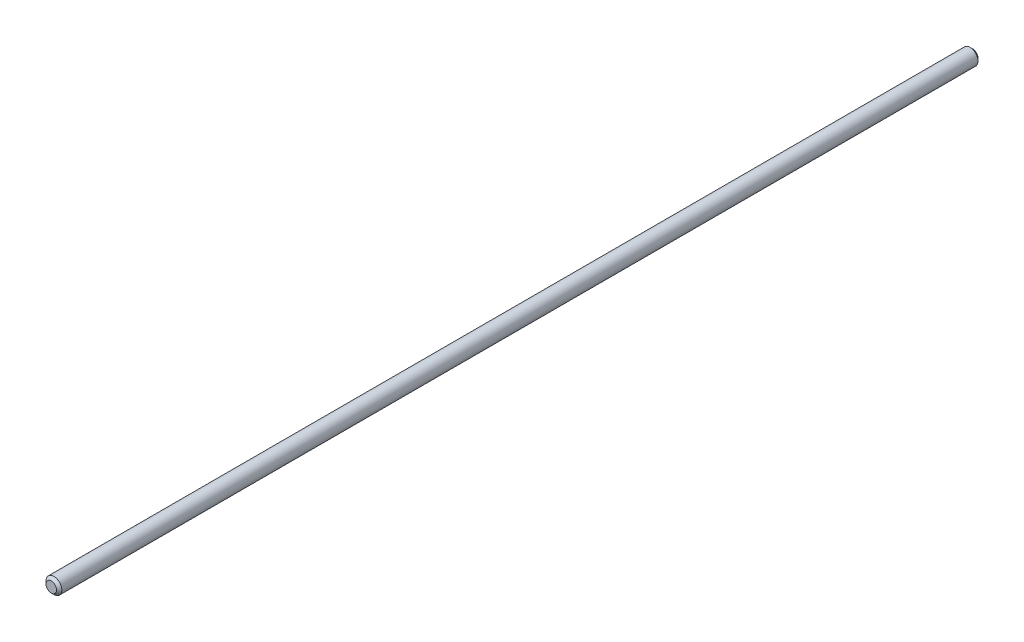
ISO-10303-21;
HEADER;
FILE_DESCRIPTION(('STEP AP214'),'2;1');
FILE_NAME('part.step','',(''),(''),'','','');
FILE_SCHEMA(('AUTOMOTIVE_DESIGN { 1 0 10303 214 1 1 1 1 }'));
ENDSEC;
DATA;
#1=APPLICATION_CONTEXT('core data for automotive mechanical design processes');
#2=APPLICATION_PROTOCOL_DEFINITION('international standard','automotive_design',2000,#1);
#3=PRODUCT_CONTEXT('',#1,'mechanical');
#4=PRODUCT('Part','Part','',(#3));
#5=PRODUCT_RELATED_PRODUCT_CATEGORY('part','',(#4));
#6=PRODUCT_DEFINITION_FORMATION('','',#4);
#7=PRODUCT_DEFINITION_CONTEXT('part definition',#1,'design');
#8=PRODUCT_DEFINITION('design','',#6,#7);
#9=PRODUCT_DEFINITION_SHAPE('','',#8);
#10=(LENGTH_UNIT() NAMED_UNIT(*) SI_UNIT(.MILLI.,.METRE.));
#11=(NAMED_UNIT(*) PLANE_ANGLE_UNIT() SI_UNIT($,.RADIAN.));
#12=(NAMED_UNIT(*) SI_UNIT($,.STERADIAN.) SOLID_ANGLE_UNIT());
#13=UNCERTAINTY_MEASURE_WITH_UNIT(LENGTH_MEASURE(1.E-05),#10,'distance_accuracy_value','');
#14=(GEOMETRIC_REPRESENTATION_CONTEXT(3) GLOBAL_UNCERTAINTY_ASSIGNED_CONTEXT((#13)) GLOBAL_UNIT_ASSIGNED_CONTEXT((#10,
#11,#12)) REPRESENTATION_CONTEXT('',''));
#15=CARTESIAN_POINT('',(0.,0.,0.));
#16=DIRECTION('',(0.,0.,1.));
#17=DIRECTION('',(1.,0.,0.));
#18=AXIS2_PLACEMENT_3D('',#15,#16,#17);
#19=CARTESIAN_POINT('',(0.,0.,175.));
#20=DIRECTION('',(0.,0.,-1.));
#21=DIRECTION('',(-1.,0.,0.));
#22=AXIS2_PLACEMENT_3D('',#19,#20,#21);
#23=CYLINDRICAL_SURFACE('',#22,1.5);
#24=CARTESIAN_POINT('',(0.,0.,0.500000000000028));
#25=DIRECTION('',(0.,0.,1.));
#26=DIRECTION('',(1.,0.,0.));
#27=AXIS2_PLACEMENT_3D('',#24,#25,#26);
#28=CIRCLE('',#27,1.5);
#29=CARTESIAN_POINT('',(1.5,0.,0.500000000000028));
#30=VERTEX_POINT('',#29);
#31=EDGE_CURVE('E47',#30,#30,#28,.T.);
#32=ORIENTED_EDGE('',*,*,#31,.T.);
#33=EDGE_LOOP('',(#32));
#34=FACE_BOUND('',#33,.T.);
#35=CARTESIAN_POINT('',(0.,0.,174.5));
#36=DIRECTION('',(0.,0.,1.));
#37=DIRECTION('',(1.,0.,0.));
#38=AXIS2_PLACEMENT_3D('',#35,#36,#37);
#39=CIRCLE('',#38,1.5);
#40=CARTESIAN_POINT('',(1.5,0.,174.5));
#41=VERTEX_POINT('',#40);
#42=EDGE_CURVE('E51',#41,#41,#39,.F.);
#43=ORIENTED_EDGE('',*,*,#42,.T.);
#44=EDGE_LOOP('',(#43));
#45=FACE_BOUND('',#44,.T.);
#46=ADVANCED_FACE('F35',(#34,#45),#23,.T.);
#47=CARTESIAN_POINT('',(0.,0.,175.));
#48=DIRECTION('',(0.,0.,1.));
#49=DIRECTION('',(1.,0.,0.));
#50=AXIS2_PLACEMENT_3D('',#47,#48,#49);
#51=PLANE('',#50);
#52=CARTESIAN_POINT('',(0.,0.,175.));
#53=DIRECTION('',(0.,0.,1.));
#54=DIRECTION('',(1.,0.,0.));
#55=AXIS2_PLACEMENT_3D('',#52,#53,#54);
#56=CIRCLE('',#55,0.999999999999987);
#57=CARTESIAN_POINT('',(0.999999999999987,0.,175.));
#58=VERTEX_POINT('',#57);
#59=EDGE_CURVE('E10',#58,#58,#56,.T.);
#60=ORIENTED_EDGE('',*,*,#59,.T.);
#61=EDGE_LOOP('',(#60));
#62=FACE_BOUND('',#61,.T.);
#63=ADVANCED_FACE('F67',(#62),#51,.T.);
#64=CARTESIAN_POINT('',(0.,0.,0.));
#65=DIRECTION('',(0.,0.,1.));
#66=DIRECTION('',(1.,0.,0.));
#67=AXIS2_PLACEMENT_3D('',#64,#65,#66);
#68=PLANE('',#67);
#69=CARTESIAN_POINT('',(0.,0.,0.));
#70=DIRECTION('',(0.,0.,1.));
#71=DIRECTION('',(1.,0.,0.));
#72=AXIS2_PLACEMENT_3D('',#69,#70,#71);
#73=CIRCLE('',#72,0.999999999999959);
#74=CARTESIAN_POINT('',(0.999999999999959,0.,0.));
#75=VERTEX_POINT('',#74);
#76=EDGE_CURVE('E43',#75,#75,#73,.F.);
#77=ORIENTED_EDGE('',*,*,#76,.T.);
#78=EDGE_LOOP('',(#77));
#79=FACE_BOUND('',#78,.T.);
#80=ADVANCED_FACE('F64',(#79),#68,.F.);
#81=CARTESIAN_POINT('',(0.,0.,0.500000000000028));
#82=DIRECTION('',(0.,0.,1.));
#83=DIRECTION('',(1.,0.,0.));
#84=AXIS2_PLACEMENT_3D('',#81,#82,#83);
#85=CONICAL_SURFACE('',#84,1.5,0.785398163397461);
#86=ORIENTED_EDGE('',*,*,#76,.F.);
#87=EDGE_LOOP('',(#86));
#88=FACE_BOUND('',#87,.T.);
#89=ORIENTED_EDGE('',*,*,#31,.F.);
#90=EDGE_LOOP('',(#89));
#91=FACE_BOUND('',#90,.T.);
#92=ADVANCED_FACE('F60',(#88,#91),#85,.T.);
#93=CARTESIAN_POINT('',(0.,0.,175.));
#94=DIRECTION('',(0.,0.,-1.));
#95=DIRECTION('',(-1.,0.,0.));
#96=AXIS2_PLACEMENT_3D('',#93,#94,#95);
#97=CONICAL_SURFACE('',#96,0.999999999999987,0.785398163397461);
#98=ORIENTED_EDGE('',*,*,#42,.F.);
#99=EDGE_LOOP('',(#98));
#100=FACE_BOUND('',#99,.T.);
#101=ORIENTED_EDGE('',*,*,#59,.F.);
#102=EDGE_LOOP('',(#101));
#103=FACE_BOUND('',#102,.T.);
#104=ADVANCED_FACE('F38',(#100,#103),#97,.T.);
#105=CLOSED_SHELL('',(#46,#63,#80,#92,#104));
#106=MANIFOLD_SOLID_BREP('B2',#105);
#107=ADVANCED_BREP_SHAPE_REPRESENTATION('',(#18,#106),#14);
#108=SHAPE_DEFINITION_REPRESENTATION(#9,#107);
ENDSEC;
END-ISO-10303-21;
